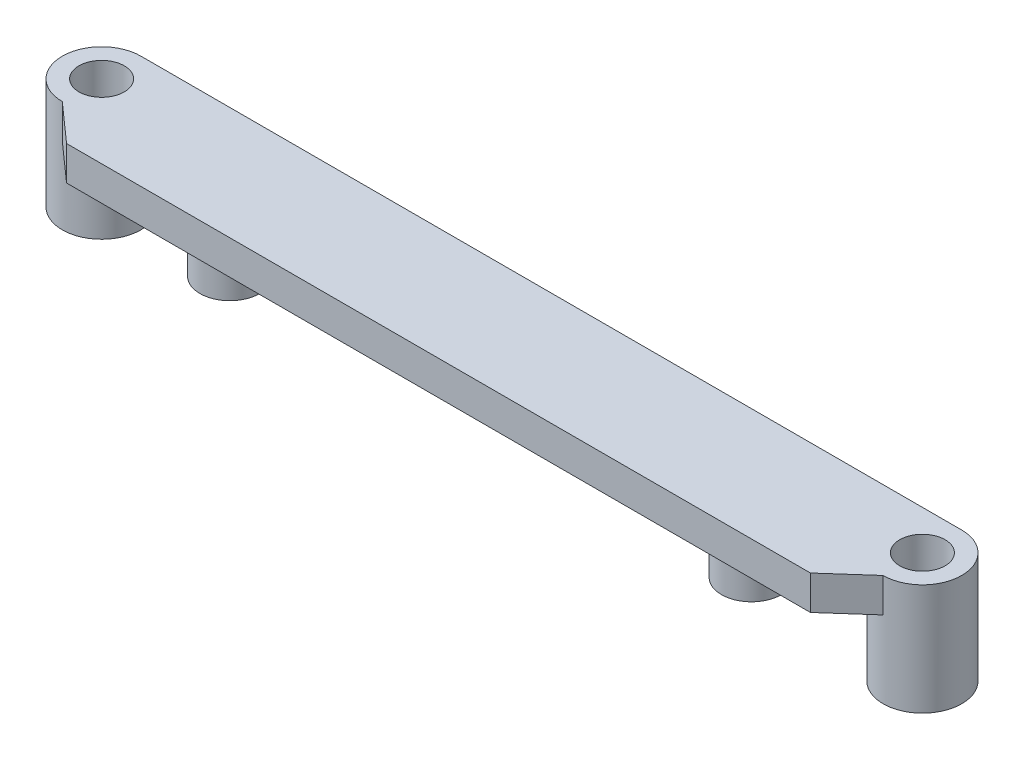
ISO-10303-21;
HEADER;
FILE_DESCRIPTION(('STEP AP214'),'2;1');
FILE_NAME('part.step','',(''),(''),'','','');
FILE_SCHEMA(('AUTOMOTIVE_DESIGN { 1 0 10303 214 1 1 1 1 }'));
ENDSEC;
DATA;
#1=APPLICATION_CONTEXT('core data for automotive mechanical design processes');
#2=APPLICATION_PROTOCOL_DEFINITION('international standard','automotive_design',2000,#1);
#3=PRODUCT_CONTEXT('',#1,'mechanical');
#4=PRODUCT('Part','Part','',(#3));
#5=PRODUCT_RELATED_PRODUCT_CATEGORY('part','',(#4));
#6=PRODUCT_DEFINITION_FORMATION('','',#4);
#7=PRODUCT_DEFINITION_CONTEXT('part definition',#1,'design');
#8=PRODUCT_DEFINITION('design','',#6,#7);
#9=PRODUCT_DEFINITION_SHAPE('','',#8);
#10=(LENGTH_UNIT() NAMED_UNIT(*) SI_UNIT(.MILLI.,.METRE.));
#11=(NAMED_UNIT(*) PLANE_ANGLE_UNIT() SI_UNIT($,.RADIAN.));
#12=(NAMED_UNIT(*) SI_UNIT($,.STERADIAN.) SOLID_ANGLE_UNIT());
#13=UNCERTAINTY_MEASURE_WITH_UNIT(LENGTH_MEASURE(1.E-05),#10,'distance_accuracy_value','');
#14=(GEOMETRIC_REPRESENTATION_CONTEXT(3) GLOBAL_UNCERTAINTY_ASSIGNED_CONTEXT((#13)) GLOBAL_UNIT_ASSIGNED_CONTEXT((#10,
#11,#12)) REPRESENTATION_CONTEXT('',''));
#15=CARTESIAN_POINT('',(0.,0.,0.));
#16=DIRECTION('',(0.,0.,1.));
#17=DIRECTION('',(1.,0.,0.));
#18=AXIS2_PLACEMENT_3D('',#15,#16,#17);
#19=CARTESIAN_POINT('',(-24.,2.,-16.5));
#20=DIRECTION('',(0.,-1.,0.));
#21=DIRECTION('',(0.,0.,-1.));
#22=AXIS2_PLACEMENT_3D('',#19,#20,#21);
#23=CYLINDRICAL_SURFACE('',#22,2.29999999999999);
#24=DIRECTION('',(0.,-1.,0.));
#25=VECTOR('',#24,1.);
#26=CARTESIAN_POINT('',(-24.,2.,-18.8));
#27=LINE('',#26,#25);
#28=CARTESIAN_POINT('',(-24.,2.,-18.8));
#29=VERTEX_POINT('',#28);
#30=CARTESIAN_POINT('',(-24.,0.,-18.8));
#31=VERTEX_POINT('',#30);
#32=EDGE_CURVE('E123',#29,#31,#27,.T.);
#33=ORIENTED_EDGE('',*,*,#32,.T.);
#34=CARTESIAN_POINT('',(-24.,0.,-16.5));
#35=DIRECTION('',(0.,-1.,0.));
#36=DIRECTION('',(0.,0.,-1.));
#37=AXIS2_PLACEMENT_3D('',#34,#35,#36);
#38=CIRCLE('',#37,2.29999999999999);
#39=CARTESIAN_POINT('',(-24.,0.,-14.2));
#40=VERTEX_POINT('',#39);
#41=EDGE_CURVE('E150',#31,#40,#38,.T.);
#42=ORIENTED_EDGE('',*,*,#41,.T.);
#43=DIRECTION('',(0.,-1.,0.));
#44=VECTOR('',#43,1.);
#45=CARTESIAN_POINT('',(-24.,2.,-14.2));
#46=LINE('',#45,#44);
#47=CARTESIAN_POINT('',(-24.,2.,-14.2));
#48=VERTEX_POINT('',#47);
#49=EDGE_CURVE('E142',#48,#40,#46,.T.);
#50=ORIENTED_EDGE('',*,*,#49,.F.);
#51=CARTESIAN_POINT('',(-24.,2.,-16.5));
#52=DIRECTION('',(0.,1.,0.));
#53=DIRECTION('',(0.,0.,1.));
#54=AXIS2_PLACEMENT_3D('',#51,#52,#53);
#55=CIRCLE('',#54,2.29999999999999);
#56=EDGE_CURVE('E135',#29,#48,#55,.T.);
#57=ORIENTED_EDGE('',*,*,#56,.F.);
#58=EDGE_LOOP('',(#33,#42,#50,#57));
#59=FACE_BOUND('',#58,.T.);
#60=CARTESIAN_POINT('',(-24.,-4.5,-16.5));
#61=DIRECTION('',(0.,-1.,0.));
#62=DIRECTION('',(0.,0.,-1.));
#63=AXIS2_PLACEMENT_3D('',#60,#61,#62);
#64=CIRCLE('',#63,2.29999999999999);
#65=CARTESIAN_POINT('',(-24.,-4.5,-18.8));
#66=VERTEX_POINT('',#65);
#67=EDGE_CURVE('E129',#66,#66,#64,.T.);
#68=ORIENTED_EDGE('',*,*,#67,.F.);
#69=EDGE_LOOP('',(#68));
#70=FACE_BOUND('',#69,.T.);
#71=ADVANCED_FACE('F41',(#59,#70),#23,.T.);
#72=CARTESIAN_POINT('',(-24.,2.,-14.2));
#73=DIRECTION('',(0.66436383882992,0.,-0.747409318683659));
#74=DIRECTION('',(-0.747409318683659,0.,-0.66436383882992));
#75=AXIS2_PLACEMENT_3D('',#72,#73,#74);
#76=PLANE('',#75);
#77=DIRECTION('',(0.747409318683659,0.,0.66436383882992));
#78=VECTOR('',#77,1.);
#79=CARTESIAN_POINT('',(-24.,0.,-14.2));
#80=LINE('',#79,#78);
#81=CARTESIAN_POINT('',(-21.75,0.,-12.2));
#82=VERTEX_POINT('',#81);
#83=EDGE_CURVE('E127',#40,#82,#80,.T.);
#84=ORIENTED_EDGE('',*,*,#83,.T.);
#85=DIRECTION('',(0.,-1.,0.));
#86=VECTOR('',#85,1.);
#87=CARTESIAN_POINT('',(-21.75,2.,-12.2));
#88=LINE('',#87,#86);
#89=CARTESIAN_POINT('',(-21.75,2.,-12.2));
#90=VERTEX_POINT('',#89);
#91=EDGE_CURVE('E140',#90,#82,#88,.T.);
#92=ORIENTED_EDGE('',*,*,#91,.F.);
#93=DIRECTION('',(0.747409318683659,0.,0.66436383882992));
#94=VECTOR('',#93,1.);
#95=CARTESIAN_POINT('',(-24.,2.,-14.2));
#96=LINE('',#95,#94);
#97=EDGE_CURVE('E92',#48,#90,#96,.T.);
#98=ORIENTED_EDGE('',*,*,#97,.F.);
#99=ORIENTED_EDGE('',*,*,#49,.T.);
#100=EDGE_LOOP('',(#84,#92,#98,#99));
#101=FACE_BOUND('',#100,.T.);
#102=ADVANCED_FACE('F159',(#101),#76,.F.);
#103=CARTESIAN_POINT('',(21.75,2.,-12.2));
#104=DIRECTION('',(0.,0.,-1.));
#105=DIRECTION('',(-1.,0.,0.));
#106=AXIS2_PLACEMENT_3D('',#103,#104,#105);
#107=PLANE('',#106);
#108=DIRECTION('',(1.,0.,0.));
#109=VECTOR('',#108,1.);
#110=CARTESIAN_POINT('',(21.75,0.,-12.2));
#111=LINE('',#110,#109);
#112=CARTESIAN_POINT('',(21.75,0.,-12.2));
#113=VERTEX_POINT('',#112);
#114=EDGE_CURVE('E75',#82,#113,#111,.T.);
#115=ORIENTED_EDGE('',*,*,#114,.T.);
#116=DIRECTION('',(0.,-1.,0.));
#117=VECTOR('',#116,1.);
#118=CARTESIAN_POINT('',(21.75,2.,-12.2));
#119=LINE('',#118,#117);
#120=CARTESIAN_POINT('',(21.75,2.,-12.2));
#121=VERTEX_POINT('',#120);
#122=EDGE_CURVE('E116',#121,#113,#119,.T.);
#123=ORIENTED_EDGE('',*,*,#122,.F.);
#124=DIRECTION('',(1.,0.,0.));
#125=VECTOR('',#124,1.);
#126=CARTESIAN_POINT('',(21.75,2.,-12.2));
#127=LINE('',#126,#125);
#128=EDGE_CURVE('E108',#90,#121,#127,.T.);
#129=ORIENTED_EDGE('',*,*,#128,.F.);
#130=ORIENTED_EDGE('',*,*,#91,.T.);
#131=EDGE_LOOP('',(#115,#123,#129,#130));
#132=FACE_BOUND('',#131,.T.);
#133=ADVANCED_FACE('F161',(#132),#107,.F.);
#134=CARTESIAN_POINT('',(24.,2.,-14.2));
#135=DIRECTION('',(-0.66436383882992,0.,-0.747409318683659));
#136=DIRECTION('',(-0.747409318683659,0.,0.66436383882992));
#137=AXIS2_PLACEMENT_3D('',#134,#135,#136);
#138=PLANE('',#137);
#139=DIRECTION('',(0.747409318683659,0.,-0.66436383882992));
#140=VECTOR('',#139,1.);
#141=CARTESIAN_POINT('',(24.,0.,-14.2));
#142=LINE('',#141,#140);
#143=CARTESIAN_POINT('',(24.,0.,-14.2));
#144=VERTEX_POINT('',#143);
#145=EDGE_CURVE('E114',#113,#144,#142,.T.);
#146=ORIENTED_EDGE('',*,*,#145,.T.);
#147=DIRECTION('',(0.,-1.,0.));
#148=VECTOR('',#147,1.);
#149=CARTESIAN_POINT('',(24.,2.,-14.2));
#150=LINE('',#149,#148);
#151=CARTESIAN_POINT('',(24.,2.,-14.2));
#152=VERTEX_POINT('',#151);
#153=EDGE_CURVE('E112',#152,#144,#150,.T.);
#154=ORIENTED_EDGE('',*,*,#153,.F.);
#155=DIRECTION('',(0.747409318683659,0.,-0.66436383882992));
#156=VECTOR('',#155,1.);
#157=CARTESIAN_POINT('',(24.,2.,-14.2));
#158=LINE('',#157,#156);
#159=EDGE_CURVE('E101',#121,#152,#158,.T.);
#160=ORIENTED_EDGE('',*,*,#159,.F.);
#161=ORIENTED_EDGE('',*,*,#122,.T.);
#162=EDGE_LOOP('',(#146,#154,#160,#161));
#163=FACE_BOUND('',#162,.T.);
#164=ADVANCED_FACE('F113',(#163),#138,.F.);
#165=CARTESIAN_POINT('',(24.,2.,-16.5));
#166=DIRECTION('',(0.,-1.,0.));
#167=DIRECTION('',(0.,0.,-1.));
#168=AXIS2_PLACEMENT_3D('',#165,#166,#167);
#169=CYLINDRICAL_SURFACE('',#168,2.29999999999999);
#170=ORIENTED_EDGE('',*,*,#153,.T.);
#171=CARTESIAN_POINT('',(24.,0.,-16.5));
#172=DIRECTION('',(0.,-1.,0.));
#173=DIRECTION('',(0.,0.,-1.));
#174=AXIS2_PLACEMENT_3D('',#171,#172,#173);
#175=CIRCLE('',#174,2.3);
#176=CARTESIAN_POINT('',(24.,0.,-18.8));
#177=VERTEX_POINT('',#176);
#178=EDGE_CURVE('E83',#144,#177,#175,.T.);
#179=ORIENTED_EDGE('',*,*,#178,.T.);
#180=DIRECTION('',(0.,-1.,0.));
#181=VECTOR('',#180,1.);
#182=CARTESIAN_POINT('',(24.,2.,-18.8));
#183=LINE('',#182,#181);
#184=CARTESIAN_POINT('',(24.,2.,-18.8));
#185=VERTEX_POINT('',#184);
#186=EDGE_CURVE('E117',#185,#177,#183,.T.);
#187=ORIENTED_EDGE('',*,*,#186,.F.);
#188=CARTESIAN_POINT('',(24.,2.,-16.5));
#189=DIRECTION('',(0.,1.,0.));
#190=DIRECTION('',(0.,0.,1.));
#191=AXIS2_PLACEMENT_3D('',#188,#189,#190);
#192=CIRCLE('',#191,2.29999999999999);
#193=EDGE_CURVE('E105',#152,#185,#192,.T.);
#194=ORIENTED_EDGE('',*,*,#193,.F.);
#195=EDGE_LOOP('',(#170,#179,#187,#194));
#196=FACE_BOUND('',#195,.T.);
#197=CARTESIAN_POINT('',(24.,-4.5,-16.5));
#198=DIRECTION('',(0.,-1.,0.));
#199=DIRECTION('',(0.,0.,-1.));
#200=AXIS2_PLACEMENT_3D('',#197,#198,#199);
#201=CIRCLE('',#200,2.3);
#202=CARTESIAN_POINT('',(24.,-4.5,-18.8));
#203=VERTEX_POINT('',#202);
#204=EDGE_CURVE('E152',#203,#203,#201,.T.);
#205=ORIENTED_EDGE('',*,*,#204,.F.);
#206=EDGE_LOOP('',(#205));
#207=FACE_BOUND('',#206,.T.);
#208=ADVANCED_FACE('F119',(#196,#207),#169,.T.);
#209=CARTESIAN_POINT('',(-24.,2.,-18.8));
#210=DIRECTION('',(0.,0.,1.));
#211=DIRECTION('',(1.,0.,0.));
#212=AXIS2_PLACEMENT_3D('',#209,#210,#211);
#213=PLANE('',#212);
#214=DIRECTION('',(-1.,0.,0.));
#215=VECTOR('',#214,1.);
#216=CARTESIAN_POINT('',(-24.,0.,-18.8));
#217=LINE('',#216,#215);
#218=EDGE_CURVE('E132',#177,#31,#217,.T.);
#219=ORIENTED_EDGE('',*,*,#218,.T.);
#220=ORIENTED_EDGE('',*,*,#32,.F.);
#221=DIRECTION('',(-1.,0.,0.));
#222=VECTOR('',#221,1.);
#223=CARTESIAN_POINT('',(-24.,2.,-18.8));
#224=LINE('',#223,#222);
#225=EDGE_CURVE('E57',#185,#29,#224,.T.);
#226=ORIENTED_EDGE('',*,*,#225,.F.);
#227=ORIENTED_EDGE('',*,*,#186,.T.);
#228=EDGE_LOOP('',(#219,#220,#226,#227));
#229=FACE_BOUND('',#228,.T.);
#230=ADVANCED_FACE('F210',(#229),#213,.F.);
#231=CARTESIAN_POINT('',(-24.,2.,-16.5));
#232=DIRECTION('',(0.,1.,0.));
#233=DIRECTION('',(0.,0.,1.));
#234=AXIS2_PLACEMENT_3D('',#231,#232,#233);
#235=PLANE('',#234);
#236=CARTESIAN_POINT('',(24.,2.,-16.5));
#237=DIRECTION('',(0.,1.,0.));
#238=DIRECTION('',(0.,0.,-1.));
#239=AXIS2_PLACEMENT_3D('',#236,#237,#238);
#240=CIRCLE('',#239,1.325);
#241=CARTESIAN_POINT('',(24.,2.,-17.825));
#242=VERTEX_POINT('',#241);
#243=EDGE_CURVE('E175',#242,#242,#240,.T.);
#244=ORIENTED_EDGE('',*,*,#243,.F.);
#245=EDGE_LOOP('',(#244));
#246=FACE_BOUND('',#245,.T.);
#247=CARTESIAN_POINT('',(-24.,2.,-16.5));
#248=DIRECTION('',(0.,1.,0.));
#249=DIRECTION('',(0.,0.,1.));
#250=AXIS2_PLACEMENT_3D('',#247,#248,#249);
#251=CIRCLE('',#250,1.325);
#252=CARTESIAN_POINT('',(-24.,2.,-15.175));
#253=VERTEX_POINT('',#252);
#254=EDGE_CURVE('E172',#253,#253,#251,.T.);
#255=ORIENTED_EDGE('',*,*,#254,.F.);
#256=EDGE_LOOP('',(#255));
#257=FACE_BOUND('',#256,.T.);
#258=ORIENTED_EDGE('',*,*,#56,.T.);
#259=ORIENTED_EDGE('',*,*,#97,.T.);
#260=ORIENTED_EDGE('',*,*,#128,.T.);
#261=ORIENTED_EDGE('',*,*,#159,.T.);
#262=ORIENTED_EDGE('',*,*,#193,.T.);
#263=ORIENTED_EDGE('',*,*,#225,.T.);
#264=EDGE_LOOP('',(#258,#259,#260,#261,#262,#263));
#265=FACE_BOUND('',#264,.T.);
#266=ADVANCED_FACE('F103',(#246,#257,#265),#235,.T.);
#267=CARTESIAN_POINT('',(-24.,0.,-16.5));
#268=DIRECTION('',(0.,1.,0.));
#269=DIRECTION('',(0.,0.,1.));
#270=AXIS2_PLACEMENT_3D('',#267,#268,#269);
#271=PLANE('',#270);
#272=CARTESIAN_POINT('',(-15.25,0.,-15.25));
#273=DIRECTION('',(0.,1.,0.));
#274=DIRECTION('',(0.,0.,1.));
#275=AXIS2_PLACEMENT_3D('',#272,#273,#274);
#276=CIRCLE('',#275,1.75);
#277=CARTESIAN_POINT('',(-15.25,0.,-13.5));
#278=VERTEX_POINT('',#277);
#279=EDGE_CURVE('E11',#278,#278,#276,.F.);
#280=ORIENTED_EDGE('',*,*,#279,.F.);
#281=EDGE_LOOP('',(#280));
#282=FACE_BOUND('',#281,.T.);
#283=CARTESIAN_POINT('',(15.25,0.,-15.25));
#284=DIRECTION('',(0.,1.,0.));
#285=DIRECTION('',(0.,0.,1.));
#286=AXIS2_PLACEMENT_3D('',#283,#284,#285);
#287=CIRCLE('',#286,1.75);
#288=CARTESIAN_POINT('',(15.25,0.,-13.5));
#289=VERTEX_POINT('',#288);
#290=EDGE_CURVE('E49',#289,#289,#287,.F.);
#291=ORIENTED_EDGE('',*,*,#290,.F.);
#292=EDGE_LOOP('',(#291));
#293=FACE_BOUND('',#292,.T.);
#294=ORIENTED_EDGE('',*,*,#41,.F.);
#295=ORIENTED_EDGE('',*,*,#218,.F.);
#296=ORIENTED_EDGE('',*,*,#178,.F.);
#297=ORIENTED_EDGE('',*,*,#145,.F.);
#298=ORIENTED_EDGE('',*,*,#114,.F.);
#299=ORIENTED_EDGE('',*,*,#83,.F.);
#300=EDGE_LOOP('',(#294,#295,#296,#297,#298,#299));
#301=FACE_BOUND('',#300,.T.);
#302=ADVANCED_FACE('F163',(#282,#293,#301),#271,.F.);
#303=CARTESIAN_POINT('',(24.,-4.5,-16.5));
#304=DIRECTION('',(0.,-1.,0.));
#305=DIRECTION('',(0.,0.,-1.));
#306=AXIS2_PLACEMENT_3D('',#303,#304,#305);
#307=PLANE('',#306);
#308=CARTESIAN_POINT('',(24.,-4.5,-16.5));
#309=DIRECTION('',(0.,1.,0.));
#310=DIRECTION('',(0.,0.,-1.));
#311=AXIS2_PLACEMENT_3D('',#308,#309,#310);
#312=CIRCLE('',#311,1.325);
#313=CARTESIAN_POINT('',(24.,-4.5,-17.825));
#314=VERTEX_POINT('',#313);
#315=EDGE_CURVE('E178',#314,#314,#312,.T.);
#316=ORIENTED_EDGE('',*,*,#315,.T.);
#317=EDGE_LOOP('',(#316));
#318=FACE_BOUND('',#317,.T.);
#319=ORIENTED_EDGE('',*,*,#204,.T.);
#320=EDGE_LOOP('',(#319));
#321=FACE_BOUND('',#320,.T.);
#322=ADVANCED_FACE('F199',(#318,#321),#307,.T.);
#323=CARTESIAN_POINT('',(-24.,-4.5,-16.5));
#324=DIRECTION('',(0.,-1.,0.));
#325=DIRECTION('',(0.,0.,-1.));
#326=AXIS2_PLACEMENT_3D('',#323,#324,#325);
#327=PLANE('',#326);
#328=CARTESIAN_POINT('',(-24.,-4.5,-16.5));
#329=DIRECTION('',(0.,1.,0.));
#330=DIRECTION('',(0.,0.,1.));
#331=AXIS2_PLACEMENT_3D('',#328,#329,#330);
#332=CIRCLE('',#331,1.325);
#333=CARTESIAN_POINT('',(-24.,-4.5,-15.175));
#334=VERTEX_POINT('',#333);
#335=EDGE_CURVE('E155',#334,#334,#332,.T.);
#336=ORIENTED_EDGE('',*,*,#335,.T.);
#337=EDGE_LOOP('',(#336));
#338=FACE_BOUND('',#337,.T.);
#339=ORIENTED_EDGE('',*,*,#67,.T.);
#340=EDGE_LOOP('',(#339));
#341=FACE_BOUND('',#340,.T.);
#342=ADVANCED_FACE('F206',(#338,#341),#327,.T.);
#343=CARTESIAN_POINT('',(-24.,-4.5,-16.5));
#344=DIRECTION('',(0.,1.,0.));
#345=DIRECTION('',(0.,0.,1.));
#346=AXIS2_PLACEMENT_3D('',#343,#344,#345);
#347=CYLINDRICAL_SURFACE('',#346,1.325);
#348=ORIENTED_EDGE('',*,*,#335,.F.);
#349=EDGE_LOOP('',(#348));
#350=FACE_BOUND('',#349,.T.);
#351=ORIENTED_EDGE('',*,*,#254,.T.);
#352=EDGE_LOOP('',(#351));
#353=FACE_BOUND('',#352,.T.);
#354=ADVANCED_FACE('F250',(#350,#353),#347,.F.);
#355=CARTESIAN_POINT('',(24.,-4.5,-16.5));
#356=DIRECTION('',(0.,1.,0.));
#357=DIRECTION('',(0.,0.,1.));
#358=AXIS2_PLACEMENT_3D('',#355,#356,#357);
#359=CYLINDRICAL_SURFACE('',#358,1.325);
#360=ORIENTED_EDGE('',*,*,#315,.F.);
#361=EDGE_LOOP('',(#360));
#362=FACE_BOUND('',#361,.T.);
#363=ORIENTED_EDGE('',*,*,#243,.T.);
#364=EDGE_LOOP('',(#363));
#365=FACE_BOUND('',#364,.T.);
#366=ADVANCED_FACE('F258',(#362,#365),#359,.F.);
#367=CARTESIAN_POINT('',(15.25,-3.,-15.25));
#368=DIRECTION('',(0.,1.,0.));
#369=DIRECTION('',(0.,0.,1.));
#370=AXIS2_PLACEMENT_3D('',#367,#368,#369);
#371=CYLINDRICAL_SURFACE('',#370,1.75);
#372=CARTESIAN_POINT('',(15.25,-3.,-15.25));
#373=DIRECTION('',(0.,-1.,0.));
#374=DIRECTION('',(0.,0.,-1.));
#375=AXIS2_PLACEMENT_3D('',#372,#373,#374);
#376=CIRCLE('',#375,1.75);
#377=CARTESIAN_POINT('',(15.25,-3.,-17.));
#378=VERTEX_POINT('',#377);
#379=EDGE_CURVE('E182',#378,#378,#376,.T.);
#380=ORIENTED_EDGE('',*,*,#379,.F.);
#381=EDGE_LOOP('',(#380));
#382=FACE_BOUND('',#381,.T.);
#383=ORIENTED_EDGE('',*,*,#290,.T.);
#384=EDGE_LOOP('',(#383));
#385=FACE_BOUND('',#384,.T.);
#386=ADVANCED_FACE('F266',(#382,#385),#371,.T.);
#387=CARTESIAN_POINT('',(15.25,-3.,-15.25));
#388=DIRECTION('',(0.,-1.,0.));
#389=DIRECTION('',(0.,0.,-1.));
#390=AXIS2_PLACEMENT_3D('',#387,#388,#389);
#391=PLANE('',#390);
#392=ORIENTED_EDGE('',*,*,#379,.T.);
#393=EDGE_LOOP('',(#392));
#394=FACE_BOUND('',#393,.T.);
#395=ADVANCED_FACE('F193',(#394),#391,.T.);
#396=CARTESIAN_POINT('',(-15.25,-3.,-15.25));
#397=DIRECTION('',(0.,1.,0.));
#398=DIRECTION('',(0.,0.,1.));
#399=AXIS2_PLACEMENT_3D('',#396,#397,#398);
#400=CYLINDRICAL_SURFACE('',#399,1.75);
#401=CARTESIAN_POINT('',(-15.25,-3.,-15.25));
#402=DIRECTION('',(0.,-1.,0.));
#403=DIRECTION('',(0.,0.,-1.));
#404=AXIS2_PLACEMENT_3D('',#401,#402,#403);
#405=CIRCLE('',#404,1.75);
#406=CARTESIAN_POINT('',(-15.25,-3.,-17.));
#407=VERTEX_POINT('',#406);
#408=EDGE_CURVE('E181',#407,#407,#405,.T.);
#409=ORIENTED_EDGE('',*,*,#408,.F.);
#410=EDGE_LOOP('',(#409));
#411=FACE_BOUND('',#410,.T.);
#412=ORIENTED_EDGE('',*,*,#279,.T.);
#413=EDGE_LOOP('',(#412));
#414=FACE_BOUND('',#413,.T.);
#415=ADVANCED_FACE('F190',(#411,#414),#400,.T.);
#416=CARTESIAN_POINT('',(-15.25,-3.,-15.25));
#417=DIRECTION('',(0.,-1.,0.));
#418=DIRECTION('',(0.,0.,-1.));
#419=AXIS2_PLACEMENT_3D('',#416,#417,#418);
#420=PLANE('',#419);
#421=ORIENTED_EDGE('',*,*,#408,.T.);
#422=EDGE_LOOP('',(#421));
#423=FACE_BOUND('',#422,.T.);
#424=ADVANCED_FACE('F188',(#423),#420,.T.);
#425=CLOSED_SHELL('',(#71,#102,#133,#164,#208,#230,#266,#302,#322,#342,#354,#366,#386,#395,#415,#424));
#426=MANIFOLD_SOLID_BREP('B2',#425);
#427=ADVANCED_BREP_SHAPE_REPRESENTATION('',(#18,#426),#14);
#428=SHAPE_DEFINITION_REPRESENTATION(#9,#427);
ENDSEC;
END-ISO-10303-21;
